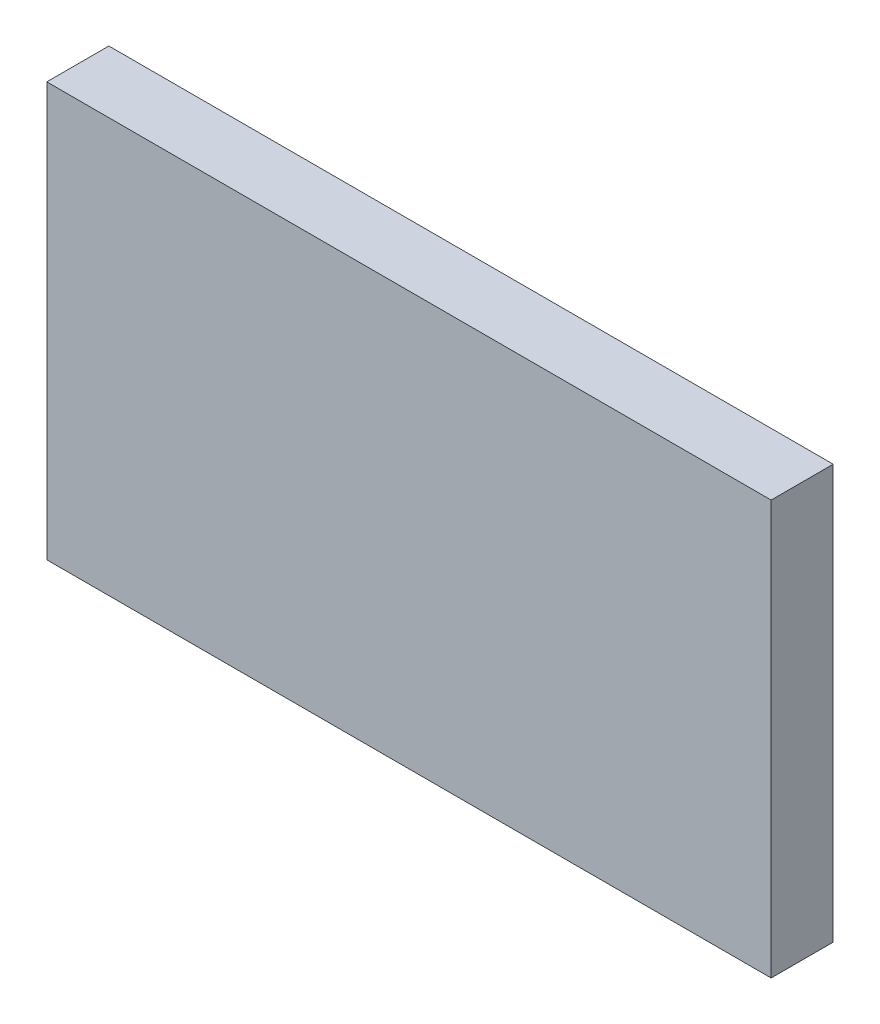
ISO-10303-21;
HEADER;
FILE_DESCRIPTION(('STEP AP214'),'2;1');
FILE_NAME('part.step','',(''),(''),'','','');
FILE_SCHEMA(('AUTOMOTIVE_DESIGN { 1 0 10303 214 1 1 1 1 }'));
ENDSEC;
DATA;
#1=APPLICATION_CONTEXT('core data for automotive mechanical design processes');
#2=APPLICATION_PROTOCOL_DEFINITION('international standard','automotive_design',2000,#1);
#3=PRODUCT_CONTEXT('',#1,'mechanical');
#4=PRODUCT('Part','Part','',(#3));
#5=PRODUCT_RELATED_PRODUCT_CATEGORY('part','',(#4));
#6=PRODUCT_DEFINITION_FORMATION('','',#4);
#7=PRODUCT_DEFINITION_CONTEXT('part definition',#1,'design');
#8=PRODUCT_DEFINITION('design','',#6,#7);
#9=PRODUCT_DEFINITION_SHAPE('','',#8);
#10=(LENGTH_UNIT() NAMED_UNIT(*) SI_UNIT(.MILLI.,.METRE.));
#11=(NAMED_UNIT(*) PLANE_ANGLE_UNIT() SI_UNIT($,.RADIAN.));
#12=(NAMED_UNIT(*) SI_UNIT($,.STERADIAN.) SOLID_ANGLE_UNIT());
#13=UNCERTAINTY_MEASURE_WITH_UNIT(LENGTH_MEASURE(1.E-05),#10,'distance_accuracy_value','');
#14=(GEOMETRIC_REPRESENTATION_CONTEXT(3) GLOBAL_UNCERTAINTY_ASSIGNED_CONTEXT((#13)) GLOBAL_UNIT_ASSIGNED_CONTEXT((#10,
#11,#12)) REPRESENTATION_CONTEXT('',''));
#15=CARTESIAN_POINT('',(0.,0.,0.));
#16=DIRECTION('',(0.,0.,1.));
#17=DIRECTION('',(1.,0.,0.));
#18=AXIS2_PLACEMENT_3D('',#15,#16,#17);
#19=CARTESIAN_POINT('',(-9.5,-1.,0.3));
#20=DIRECTION('',(0.,0.,1.));
#21=DIRECTION('',(1.,0.,0.));
#22=AXIS2_PLACEMENT_3D('',#19,#20,#21);
#23=PLANE('',#22);
#24=DIRECTION('',(0.,1.,0.));
#25=VECTOR('',#24,1.);
#26=CARTESIAN_POINT('',(-6.,-1.,0.3));
#27=LINE('',#26,#25);
#28=CARTESIAN_POINT('',(-6.,1.,0.3));
#29=VERTEX_POINT('',#28);
#30=CARTESIAN_POINT('',(-6.,-1.,0.3));
#31=VERTEX_POINT('',#30);
#32=EDGE_CURVE('E76',#29,#31,#27,.F.);
#33=ORIENTED_EDGE('',*,*,#32,.F.);
#34=DIRECTION('',(1.,0.,0.));
#35=VECTOR('',#34,1.);
#36=CARTESIAN_POINT('',(-9.5,1.,0.3));
#37=LINE('',#36,#35);
#38=CARTESIAN_POINT('',(-9.5,1.,0.3));
#39=VERTEX_POINT('',#38);
#40=EDGE_CURVE('E58',#39,#29,#37,.T.);
#41=ORIENTED_EDGE('',*,*,#40,.F.);
#42=DIRECTION('',(0.,1.,0.));
#43=VECTOR('',#42,1.);
#44=CARTESIAN_POINT('',(-9.5,-1.,0.3));
#45=LINE('',#44,#43);
#46=CARTESIAN_POINT('',(-9.5,-1.,0.3));
#47=VERTEX_POINT('',#46);
#48=EDGE_CURVE('E20',#39,#47,#45,.F.);
#49=ORIENTED_EDGE('',*,*,#48,.T.);
#50=DIRECTION('',(1.,0.,0.));
#51=VECTOR('',#50,1.);
#52=CARTESIAN_POINT('',(-9.5,-1.,0.3));
#53=LINE('',#52,#51);
#54=EDGE_CURVE('E55',#47,#31,#53,.T.);
#55=ORIENTED_EDGE('',*,*,#54,.T.);
#56=EDGE_LOOP('',(#33,#41,#49,#55));
#57=FACE_BOUND('',#56,.T.);
#58=ADVANCED_FACE('F17',(#57),#23,.T.);
#59=CARTESIAN_POINT('',(-9.5,-1.,0.));
#60=DIRECTION('',(1.,0.,0.));
#61=DIRECTION('',(0.,0.,-1.));
#62=AXIS2_PLACEMENT_3D('',#59,#60,#61);
#63=PLANE('',#62);
#64=DIRECTION('',(0.,0.,1.));
#65=VECTOR('',#64,1.);
#66=CARTESIAN_POINT('',(-9.5,1.,0.));
#67=LINE('',#66,#65);
#68=CARTESIAN_POINT('',(-9.5,1.,0.));
#69=VERTEX_POINT('',#68);
#70=EDGE_CURVE('E78',#69,#39,#67,.T.);
#71=ORIENTED_EDGE('',*,*,#70,.F.);
#72=DIRECTION('',(0.,1.,0.));
#73=VECTOR('',#72,1.);
#74=CARTESIAN_POINT('',(-9.5,-1.,0.));
#75=LINE('',#74,#73);
#76=CARTESIAN_POINT('',(-9.5,-1.,0.));
#77=VERTEX_POINT('',#76);
#78=EDGE_CURVE('E73',#69,#77,#75,.F.);
#79=ORIENTED_EDGE('',*,*,#78,.T.);
#80=DIRECTION('',(0.,0.,1.));
#81=VECTOR('',#80,1.);
#82=CARTESIAN_POINT('',(-9.5,-1.,0.));
#83=LINE('',#82,#81);
#84=EDGE_CURVE('E63',#77,#47,#83,.T.);
#85=ORIENTED_EDGE('',*,*,#84,.T.);
#86=ORIENTED_EDGE('',*,*,#48,.F.);
#87=EDGE_LOOP('',(#71,#79,#85,#86));
#88=FACE_BOUND('',#87,.T.);
#89=ADVANCED_FACE('F72',(#88),#63,.F.);
#90=CARTESIAN_POINT('',(-9.5,-1.,0.));
#91=DIRECTION('',(0.,1.,0.));
#92=DIRECTION('',(0.,0.,1.));
#93=AXIS2_PLACEMENT_3D('',#90,#91,#92);
#94=PLANE('',#93);
#95=ORIENTED_EDGE('',*,*,#54,.F.);
#96=ORIENTED_EDGE('',*,*,#84,.F.);
#97=DIRECTION('',(1.,0.,0.));
#98=VECTOR('',#97,1.);
#99=CARTESIAN_POINT('',(-9.5,-1.,0.));
#100=LINE('',#99,#98);
#101=CARTESIAN_POINT('',(-6.,-1.,0.));
#102=VERTEX_POINT('',#101);
#103=EDGE_CURVE('E83',#77,#102,#100,.T.);
#104=ORIENTED_EDGE('',*,*,#103,.T.);
#105=DIRECTION('',(0.,0.,-1.));
#106=VECTOR('',#105,1.);
#107=CARTESIAN_POINT('',(-6.,-1.,0.));
#108=LINE('',#107,#106);
#109=EDGE_CURVE('E69',#31,#102,#108,.T.);
#110=ORIENTED_EDGE('',*,*,#109,.F.);
#111=EDGE_LOOP('',(#95,#96,#104,#110));
#112=FACE_BOUND('',#111,.T.);
#113=ADVANCED_FACE('F66',(#112),#94,.F.);
#114=CARTESIAN_POINT('',(-6.,-1.,0.));
#115=DIRECTION('',(1.,0.,0.));
#116=DIRECTION('',(0.,0.,-1.));
#117=AXIS2_PLACEMENT_3D('',#114,#115,#116);
#118=PLANE('',#117);
#119=DIRECTION('',(0.,0.,1.));
#120=VECTOR('',#119,1.);
#121=CARTESIAN_POINT('',(-6.,1.,0.));
#122=LINE('',#121,#120);
#123=CARTESIAN_POINT('',(-6.,1.,0.));
#124=VERTEX_POINT('',#123);
#125=EDGE_CURVE('E34',#29,#124,#122,.F.);
#126=ORIENTED_EDGE('',*,*,#125,.F.);
#127=ORIENTED_EDGE('',*,*,#32,.T.);
#128=ORIENTED_EDGE('',*,*,#109,.T.);
#129=DIRECTION('',(0.,1.,0.));
#130=VECTOR('',#129,1.);
#131=CARTESIAN_POINT('',(-6.,-1.,0.));
#132=LINE('',#131,#130);
#133=EDGE_CURVE('E26',#102,#124,#132,.T.);
#134=ORIENTED_EDGE('',*,*,#133,.T.);
#135=EDGE_LOOP('',(#126,#127,#128,#134));
#136=FACE_BOUND('',#135,.T.);
#137=ADVANCED_FACE('F88',(#136),#118,.T.);
#138=CARTESIAN_POINT('',(-9.5,1.,0.));
#139=DIRECTION('',(0.,1.,0.));
#140=DIRECTION('',(0.,0.,1.));
#141=AXIS2_PLACEMENT_3D('',#138,#139,#140);
#142=PLANE('',#141);
#143=ORIENTED_EDGE('',*,*,#40,.T.);
#144=ORIENTED_EDGE('',*,*,#125,.T.);
#145=DIRECTION('',(1.,0.,0.));
#146=VECTOR('',#145,1.);
#147=CARTESIAN_POINT('',(-9.5,1.,0.));
#148=LINE('',#147,#146);
#149=EDGE_CURVE('E11',#124,#69,#148,.F.);
#150=ORIENTED_EDGE('',*,*,#149,.T.);
#151=ORIENTED_EDGE('',*,*,#70,.T.);
#152=EDGE_LOOP('',(#143,#144,#150,#151));
#153=FACE_BOUND('',#152,.T.);
#154=ADVANCED_FACE('F91',(#153),#142,.T.);
#155=CARTESIAN_POINT('',(-9.5,-1.,0.));
#156=DIRECTION('',(0.,0.,1.));
#157=DIRECTION('',(1.,0.,0.));
#158=AXIS2_PLACEMENT_3D('',#155,#156,#157);
#159=PLANE('',#158);
#160=ORIENTED_EDGE('',*,*,#133,.F.);
#161=ORIENTED_EDGE('',*,*,#103,.F.);
#162=ORIENTED_EDGE('',*,*,#78,.F.);
#163=ORIENTED_EDGE('',*,*,#149,.F.);
#164=EDGE_LOOP('',(#160,#161,#162,#163));
#165=FACE_BOUND('',#164,.T.);
#166=ADVANCED_FACE('F90',(#165),#159,.F.);
#167=CLOSED_SHELL('',(#58,#89,#113,#137,#154,#166));
#168=MANIFOLD_SOLID_BREP('B1',#167);
#169=ADVANCED_BREP_SHAPE_REPRESENTATION('',(#18,#168),#14);
#170=SHAPE_DEFINITION_REPRESENTATION(#9,#169);
ENDSEC;
END-ISO-10303-21;
